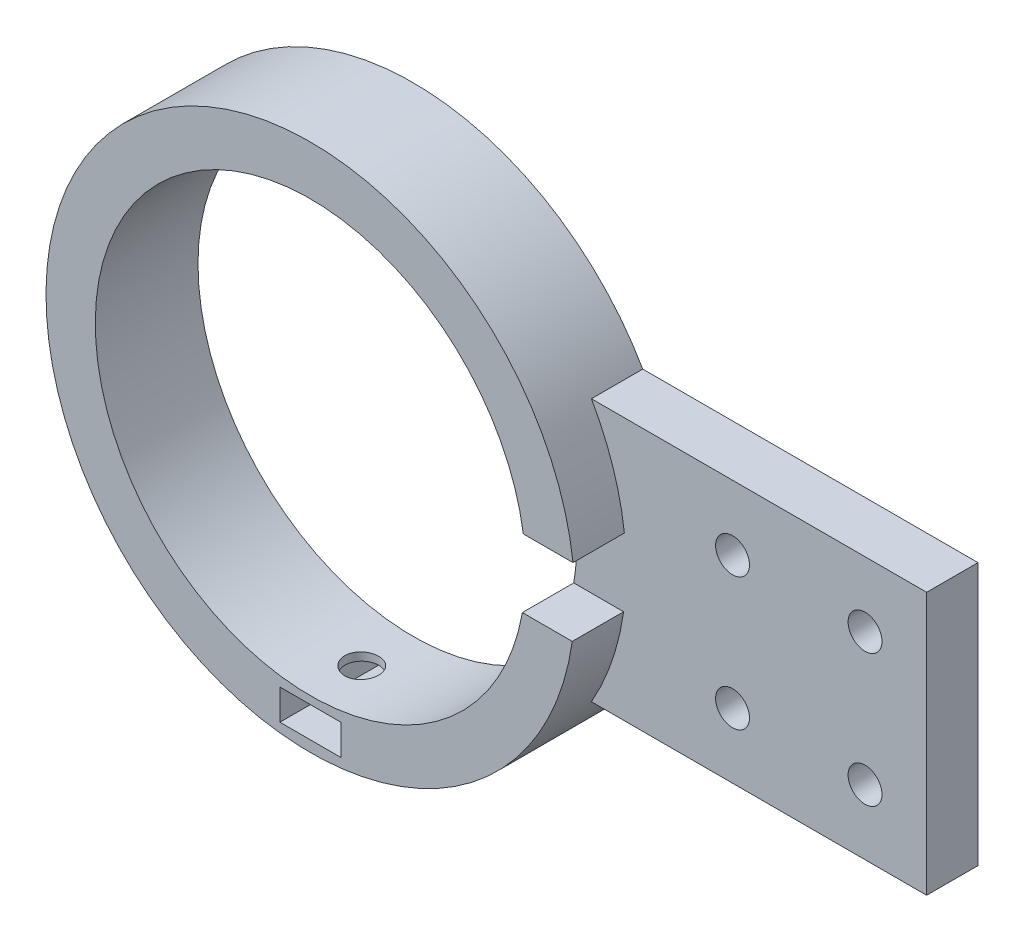
ISO-10303-21;
HEADER;
FILE_DESCRIPTION(('STEP AP214'),'2;1');
FILE_NAME('part.step','',(''),(''),'','','');
FILE_SCHEMA(('AUTOMOTIVE_DESIGN { 1 0 10303 214 1 1 1 1 }'));
ENDSEC;
DATA;
#1=APPLICATION_CONTEXT('core data for automotive mechanical design processes');
#2=APPLICATION_PROTOCOL_DEFINITION('international standard','automotive_design',2000,#1);
#3=PRODUCT_CONTEXT('',#1,'mechanical');
#4=PRODUCT('Part','Part','',(#3));
#5=PRODUCT_RELATED_PRODUCT_CATEGORY('part','',(#4));
#6=PRODUCT_DEFINITION_FORMATION('','',#4);
#7=PRODUCT_DEFINITION_CONTEXT('part definition',#1,'design');
#8=PRODUCT_DEFINITION('design','',#6,#7);
#9=PRODUCT_DEFINITION_SHAPE('','',#8);
#10=(LENGTH_UNIT() NAMED_UNIT(*) SI_UNIT(.MILLI.,.METRE.));
#11=(NAMED_UNIT(*) PLANE_ANGLE_UNIT() SI_UNIT($,.RADIAN.));
#12=(NAMED_UNIT(*) SI_UNIT($,.STERADIAN.) SOLID_ANGLE_UNIT());
#13=UNCERTAINTY_MEASURE_WITH_UNIT(LENGTH_MEASURE(1.E-05),#10,'distance_accuracy_value','');
#14=(GEOMETRIC_REPRESENTATION_CONTEXT(3) GLOBAL_UNCERTAINTY_ASSIGNED_CONTEXT((#13)) GLOBAL_UNIT_ASSIGNED_CONTEXT((#10,
#11,#12)) REPRESENTATION_CONTEXT('',''));
#15=CARTESIAN_POINT('',(0.,0.,0.));
#16=DIRECTION('',(0.,0.,1.));
#17=DIRECTION('',(1.,0.,0.));
#18=AXIS2_PLACEMENT_3D('',#15,#16,#17);
#19=CARTESIAN_POINT('',(0.,0.,20.));
#20=DIRECTION('',(0.,0.,-1.));
#21=DIRECTION('',(-1.,0.,0.));
#22=AXIS2_PLACEMENT_3D('',#19,#20,#21);
#23=CYLINDRICAL_SURFACE('',#22,51.5);
#24=CARTESIAN_POINT('',(0.,-51.5,6.7));
#25=CARTESIAN_POINT('',(-0.185158624066491,-51.499998595781,6.70000814332168));
#26=CARTESIAN_POINT('',(-0.370446658762035,-51.4989907684137,6.71563587599255));
#27=CARTESIAN_POINT('',(-0.735905826523635,-51.4950672369171,6.77775330812579));
#28=CARTESIAN_POINT('',(-0.916070760463318,-51.4921493161301,6.82427886533222));
#29=CARTESIAN_POINT('',(-1.26593717912091,-51.4847356695556,6.94684953728037));
#30=CARTESIAN_POINT('',(-1.4356441546519,-51.4802407801771,7.02287900569621));
#31=CARTESIAN_POINT('',(-1.75984319499285,-51.4701786486996,7.20227375846769));
#32=CARTESIAN_POINT('',(-1.91433871810484,-51.4646116511976,7.30563280969622));
#33=CARTESIAN_POINT('',(-2.20401550029803,-51.4530212339197,7.53692997867651));
#34=CARTESIAN_POINT('',(-2.33916976677004,-51.4469971938843,7.66490187371586));
#35=CARTESIAN_POINT('',(-2.58609660149397,-51.4351769241113,7.94172229421983));
#36=CARTESIAN_POINT('',(-2.69786818952512,-51.4293807039325,8.09057169444957));
#37=CARTESIAN_POINT('',(-2.89494084196966,-51.4186649129284,8.40507570334198));
#38=CARTESIAN_POINT('',(-2.98021935815861,-51.4137460903629,8.57074446872535));
#39=CARTESIAN_POINT('',(-3.12174086726926,-51.4053478632776,8.91408527713376));
#40=CARTESIAN_POINT('',(-3.1779841855537,-51.4018684426282,9.09175718562867));
#41=CARTESIAN_POINT('',(-3.25976351159344,-51.3967473288951,9.45379974080536));
#42=CARTESIAN_POINT('',(-3.28534197322287,-51.3951030953103,9.63816076135591));
#43=CARTESIAN_POINT('',(-3.30519656855818,-51.3938301698441,10.0085663564203));
#44=CARTESIAN_POINT('',(-3.29947307206354,-51.3942014541517,10.1946109110191));
#45=CARTESIAN_POINT('',(-3.25692143983826,-51.3969153363389,10.5628130635802));
#46=CARTESIAN_POINT('',(-3.22013925827641,-51.3992550217702,10.7449759967299));
#47=CARTESIAN_POINT('',(-3.11658565300897,-51.4056374563983,11.1005367771904));
#48=CARTESIAN_POINT('',(-3.04981404212357,-51.4096802162248,11.2739345697858));
#49=CARTESIAN_POINT('',(-2.88812485808855,-51.4190165642569,11.6071904946078));
#50=CARTESIAN_POINT('',(-2.7931864539019,-51.4243110776188,11.767038493059));
#51=CARTESIAN_POINT('',(-2.57787372714138,-51.4355533621287,12.0685465381497));
#52=CARTESIAN_POINT('',(-2.45749910351232,-51.4415011410081,12.2102063694879));
#53=CARTESIAN_POINT('',(-2.19447218095502,-51.4533926247903,12.4715842364733));
#54=CARTESIAN_POINT('',(-2.05178011413515,-51.4593363030214,12.5912622582034));
#55=CARTESIAN_POINT('',(-1.74830817960783,-51.470539481302,12.8049705907161));
#56=CARTESIAN_POINT('',(-1.58752830527452,-51.475798981101,12.8990008921036));
#57=CARTESIAN_POINT('',(-1.25242032545124,-51.4850415932231,13.0587412787928));
#58=CARTESIAN_POINT('',(-1.07809148747595,-51.4890246364787,13.1244498317027));
#59=CARTESIAN_POINT('',(-0.720845051352231,-51.495264589276,13.2256546815547));
#60=CARTESIAN_POINT('',(-0.537927558655072,-51.4975215200049,13.2611513493352));
#61=CARTESIAN_POINT('',(-0.16904332343586,-51.5000522004809,13.3008751881885));
#62=CARTESIAN_POINT('',(0.0169174389331067,-51.5003294586863,13.3051576786126));
#63=CARTESIAN_POINT('',(0.386914647836279,-51.4988788860668,13.2824761641035));
#64=CARTESIAN_POINT('',(0.570951104898467,-51.4971510662174,13.2555123302111));
#65=CARTESIAN_POINT('',(0.931719616748088,-51.4918870916977,13.1711493790303));
#66=CARTESIAN_POINT('',(1.10845763445804,-51.4883524461368,13.1137756594227));
#67=CARTESIAN_POINT('',(1.44979641038688,-51.479872440234,12.9702473716029));
#68=CARTESIAN_POINT('',(1.61439705389386,-51.4749270665614,12.8840925314191));
#69=CARTESIAN_POINT('',(1.92704189399144,-51.464172455098,12.6853069196648));
#70=CARTESIAN_POINT('',(2.07506256989622,-51.4583620166392,12.572639221297));
#71=CARTESIAN_POINT('',(2.35010888990498,-51.4465351339532,12.3240798385812));
#72=CARTESIAN_POINT('',(2.47713431698027,-51.4405186875973,12.188187914193));
#73=CARTESIAN_POINT('',(2.70677189951301,-51.4289477078512,11.8967987944526));
#74=CARTESIAN_POINT('',(2.80934815222252,-51.423393861458,11.7412732739043));
#75=CARTESIAN_POINT('',(2.98692999648366,-51.4133853552325,11.4151740364177));
#76=CARTESIAN_POINT('',(3.06193576509112,-51.4089306883413,11.2446004161259));
#77=CARTESIAN_POINT('',(3.18218539932524,-51.4016278688749,10.8933778121221));
#78=CARTESIAN_POINT('',(3.2274518213567,-51.3987784989643,10.7127365774758));
#79=CARTESIAN_POINT('',(3.28701146821876,-51.3950042318312,10.3463989420834));
#80=CARTESIAN_POINT('',(3.30130501921366,-51.3940793143431,10.1607025945918));
#81=CARTESIAN_POINT('',(3.29851000252764,-51.3942587483183,9.78988295058416));
#82=CARTESIAN_POINT('',(3.28147787672075,-51.3953594500701,9.60475922423373));
#83=CARTESIAN_POINT('',(3.21663204976162,-51.3994583542873,9.24000600163931));
#84=CARTESIAN_POINT('',(3.1688182933105,-51.4024565601615,9.06037651526627));
#85=CARTESIAN_POINT('',(3.0437792821893,-51.4100117078721,8.71170262328394));
#86=CARTESIAN_POINT('',(2.9665543134305,-51.4145686345559,8.54265811479492));
#87=CARTESIAN_POINT('',(2.78489264182225,-51.4247276387026,8.21992657033912));
#88=CARTESIAN_POINT('',(2.68045662543272,-51.4303296897989,8.06623914709059));
#89=CARTESIAN_POINT('',(2.44712835653953,-51.4419594465964,7.77829789974838));
#90=CARTESIAN_POINT('',(2.31819519824359,-51.4479878535114,7.64407725228515));
#91=CARTESIAN_POINT('',(2.03958946113101,-51.4597849959815,7.39913821921457));
#92=CARTESIAN_POINT('',(1.88991181961761,-51.4655536676914,7.2884255874964));
#93=CARTESIAN_POINT('',(1.57388788429359,-51.4761875824393,7.09355948688749));
#94=CARTESIAN_POINT('',(1.40752054283301,-51.4810516620611,7.0094401242557));
#95=CARTESIAN_POINT('',(1.06311300413596,-51.4893128617732,6.87043160822301));
#96=CARTESIAN_POINT('',(0.885086736678297,-51.492711696953,6.81550826280881));
#97=CARTESIAN_POINT('',(0.588311513144641,-51.4967699513685,6.75070701809405));
#98=CARTESIAN_POINT('',(0.471480291549071,-51.4979758278887,6.73171651921337));
#99=CARTESIAN_POINT('',(0.236450306369965,-51.499591300025,6.70636041902111));
#100=CARTESIAN_POINT('',(0.118251544784278,-51.5000008968044,6.69999479926807));
#101=CARTESIAN_POINT('',(0.,-51.5,6.7));
#102=B_SPLINE_CURVE_WITH_KNOTS('',3,(#24,#25,#26,#27,#28,#29,#30,#31,#32,#33,#34,#35,#36,#37,
#38,#39,#40,#41,#42,#43,#44,#45,#46,#47,#48,#49,#50,#51,#52,#53,#54,#55,#56,#57,#58,#59,#60,#61,
#62,#63,#64,#65,#66,#67,#68,#69,#70,#71,#72,#73,#74,#75,#76,#77,#78,#79,#80,#81,#82,#83,#84,#85,
#86,#87,#88,#89,#90,#91,#92,#93,#94,#95,#96,#97,#98,#99,#100,#101),.UNSPECIFIED.,.T.,.F.,(4,2,2,
2,2,2,2,2,2,2,2,2,2,2,2,2,2,2,2,2,2,2,2,2,2,2,2,2,2,2,2,2,2,2,2,2,2,2,4),(0.,0.555044180037114,
1.11073363183171,1.66612879577552,2.22139739843652,2.77743352917521,3.3334929647292,
3.89002437345546,4.44654954566416,5.002303345113,5.55805057893358,6.11297697175668,
6.66790682821565,7.22324811606526,7.77859597713011,8.33494494118436,8.89129410903918,
9.44767337524364,10.0040458120242,10.5594319770078,11.1148151018512,11.6697351118805,
12.2246603658593,12.7803631361644,13.3360716504313,13.8925912436079,14.4491072627902,
15.0052006924153,15.5612882659899,16.1163748753379,16.6714624818961,17.2265446924933,
17.781612901248,18.3376162514462,18.8937555341403,19.4506052069624,20.0068012977053,
20.3612807496798,20.7157596838576),.UNSPECIFIED.);
#103=CARTESIAN_POINT('',(0.,-51.5,6.7));
#104=VERTEX_POINT('',#103);
#105=EDGE_CURVE('E249',#104,#104,#102,.T.);
#106=ORIENTED_EDGE('',*,*,#105,.T.);
#107=EDGE_LOOP('',(#106));
#108=FACE_BOUND('',#107,.T.);
#109=CARTESIAN_POINT('',(0.,0.,20.));
#110=DIRECTION('',(0.,0.,1.));
#111=DIRECTION('',(1.,0.,0.));
#112=AXIS2_PLACEMENT_3D('',#109,#110,#111);
#113=CIRCLE('',#112,51.5);
#114=CARTESIAN_POINT('',(51.135544310776,6.11605330590421,20.));
#115=VERTEX_POINT('',#114);
#116=CARTESIAN_POINT('',(50.9892238996445,-7.23526406649588,20.));
#117=VERTEX_POINT('',#116);
#118=EDGE_CURVE('E197',#115,#117,#113,.T.);
#119=ORIENTED_EDGE('',*,*,#118,.F.);
#120=DIRECTION('',(0.,0.,-1.));
#121=VECTOR('',#120,1.);
#122=CARTESIAN_POINT('',(51.135544310776,6.11605330590421,20.));
#123=LINE('',#122,#121);
#124=CARTESIAN_POINT('',(51.135544310776,6.11605330590421,10.));
#125=VERTEX_POINT('',#124);
#126=EDGE_CURVE('E165',#115,#125,#123,.T.);
#127=ORIENTED_EDGE('',*,*,#126,.T.);
#128=CARTESIAN_POINT('',(0.,0.,10.));
#129=DIRECTION('',(0.,0.,1.));
#130=DIRECTION('',(1.,0.,0.));
#131=AXIS2_PLACEMENT_3D('',#128,#129,#130);
#132=CIRCLE('',#131,51.5);
#133=CARTESIAN_POINT('',(44.7151819855404,25.55,10.));
#134=VERTEX_POINT('',#133);
#135=EDGE_CURVE('E200',#125,#134,#132,.T.);
#136=ORIENTED_EDGE('',*,*,#135,.T.);
#137=DIRECTION('',(0.,0.,-1.));
#138=VECTOR('',#137,1.);
#139=CARTESIAN_POINT('',(44.7151819855404,25.55,20.));
#140=LINE('',#139,#138);
#141=CARTESIAN_POINT('',(44.7151819855404,25.55,0.));
#142=VERTEX_POINT('',#141);
#143=EDGE_CURVE('E187',#142,#134,#140,.F.);
#144=ORIENTED_EDGE('',*,*,#143,.F.);
#145=CARTESIAN_POINT('',(0.,0.,0.));
#146=DIRECTION('',(0.,0.,1.));
#147=DIRECTION('',(1.,0.,0.));
#148=AXIS2_PLACEMENT_3D('',#145,#146,#147);
#149=CIRCLE('',#148,51.5);
#150=CARTESIAN_POINT('',(44.7151819855404,-25.55,0.));
#151=VERTEX_POINT('',#150);
#152=EDGE_CURVE('E196',#142,#151,#149,.T.);
#153=ORIENTED_EDGE('',*,*,#152,.T.);
#154=DIRECTION('',(0.,0.,-1.));
#155=VECTOR('',#154,1.);
#156=CARTESIAN_POINT('',(44.7151819855404,-25.55,20.));
#157=LINE('',#156,#155);
#158=CARTESIAN_POINT('',(44.7151819855404,-25.55,10.));
#159=VERTEX_POINT('',#158);
#160=EDGE_CURVE('E193',#159,#151,#157,.T.);
#161=ORIENTED_EDGE('',*,*,#160,.F.);
#162=CARTESIAN_POINT('',(50.9892238996445,-7.23526406649588,10.));
#163=VERTEX_POINT('',#162);
#164=EDGE_CURVE('E202',#159,#163,#132,.T.);
#165=ORIENTED_EDGE('',*,*,#164,.T.);
#166=DIRECTION('',(0.,0.,-1.));
#167=VECTOR('',#166,1.);
#168=CARTESIAN_POINT('',(50.9892238996445,-7.23526406649588,20.));
#169=LINE('',#168,#167);
#170=EDGE_CURVE('E160',#163,#117,#169,.F.);
#171=ORIENTED_EDGE('',*,*,#170,.T.);
#172=EDGE_LOOP('',(#119,#127,#136,#144,#153,#161,#165,#171));
#173=FACE_BOUND('',#172,.T.);
#174=ADVANCED_FACE('F35',(#108,#173),#23,.T.);
#175=CARTESIAN_POINT('',(0.,0.,20.));
#176=DIRECTION('',(0.,0.,1.));
#177=DIRECTION('',(1.,0.,0.));
#178=AXIS2_PLACEMENT_3D('',#175,#176,#177);
#179=PLANE('',#178);
#180=DIRECTION('',(0.,-1.,0.));
#181=VECTOR('',#180,1.);
#182=CARTESIAN_POINT('',(-5.94999999999999,-43.4,20.));
#183=LINE('',#182,#181);
#184=CARTESIAN_POINT('',(-5.94999999999999,-43.4,20.));
#185=VERTEX_POINT('',#184);
#186=CARTESIAN_POINT('',(-5.94999999999999,-49.34,20.));
#187=VERTEX_POINT('',#186);
#188=EDGE_CURVE('E51',#185,#187,#183,.T.);
#189=ORIENTED_EDGE('',*,*,#188,.F.);
#190=DIRECTION('',(-1.,0.,0.));
#191=VECTOR('',#190,1.);
#192=CARTESIAN_POINT('',(-5.94999999999999,-43.4,20.));
#193=LINE('',#192,#191);
#194=CARTESIAN_POINT('',(5.95000000000001,-43.4,20.));
#195=VERTEX_POINT('',#194);
#196=EDGE_CURVE('E144',#195,#185,#193,.T.);
#197=ORIENTED_EDGE('',*,*,#196,.F.);
#198=DIRECTION('',(0.,1.,0.));
#199=VECTOR('',#198,1.);
#200=CARTESIAN_POINT('',(5.95000000000001,-43.4,20.));
#201=LINE('',#200,#199);
#202=CARTESIAN_POINT('',(5.95000000000001,-49.34,20.));
#203=VERTEX_POINT('',#202);
#204=EDGE_CURVE('E128',#203,#195,#201,.T.);
#205=ORIENTED_EDGE('',*,*,#204,.F.);
#206=DIRECTION('',(1.,0.,0.));
#207=VECTOR('',#206,1.);
#208=CARTESIAN_POINT('',(-5.94999999999999,-49.34,20.));
#209=LINE('',#208,#207);
#210=EDGE_CURVE('E137',#187,#203,#209,.T.);
#211=ORIENTED_EDGE('',*,*,#210,.F.);
#212=EDGE_LOOP('',(#189,#197,#205,#211));
#213=FACE_BOUND('',#212,.T.);
#214=DIRECTION('',(-1.,0.,0.));
#215=VECTOR('',#214,1.);
#216=CARTESIAN_POINT('',(39.,6.11605330590421,20.));
#217=LINE('',#216,#215);
#218=CARTESIAN_POINT('',(41.451223045398,6.11605330590421,20.));
#219=VERTEX_POINT('',#218);
#220=EDGE_CURVE('E158',#115,#219,#217,.T.);
#221=ORIENTED_EDGE('',*,*,#220,.F.);
#222=ORIENTED_EDGE('',*,*,#118,.T.);
#223=DIRECTION('',(1.,0.,0.));
#224=VECTOR('',#223,1.);
#225=CARTESIAN_POINT('',(39.,-7.23526406649589,20.));
#226=LINE('',#225,#224);
#227=CARTESIAN_POINT('',(41.2705821849907,-7.23526406649589,20.));
#228=VERTEX_POINT('',#227);
#229=EDGE_CURVE('E151',#228,#117,#226,.T.);
#230=ORIENTED_EDGE('',*,*,#229,.F.);
#231=CARTESIAN_POINT('',(0.,0.,20.));
#232=DIRECTION('',(0.,0.,1.));
#233=DIRECTION('',(1.,0.,0.));
#234=AXIS2_PLACEMENT_3D('',#231,#232,#233);
#235=CIRCLE('',#234,41.9);
#236=EDGE_CURVE('E168',#219,#228,#235,.T.);
#237=ORIENTED_EDGE('',*,*,#236,.F.);
#238=EDGE_LOOP('',(#221,#222,#230,#237));
#239=FACE_BOUND('',#238,.T.);
#240=ADVANCED_FACE('F141',(#213,#239),#179,.T.);
#241=CARTESIAN_POINT('',(0.,0.,0.));
#242=DIRECTION('',(0.,0.,1.));
#243=DIRECTION('',(1.,0.,0.));
#244=AXIS2_PLACEMENT_3D('',#241,#242,#243);
#245=PLANE('',#244);
#246=CARTESIAN_POINT('',(98.,12.9,0.));
#247=DIRECTION('',(0.,0.,1.));
#248=DIRECTION('',(1.,0.,0.));
#249=AXIS2_PLACEMENT_3D('',#246,#247,#248);
#250=CIRCLE('',#249,3.3);
#251=CARTESIAN_POINT('',(101.3,12.9,0.));
#252=VERTEX_POINT('',#251);
#253=EDGE_CURVE('E359',#252,#252,#250,.T.);
#254=ORIENTED_EDGE('',*,*,#253,.T.);
#255=EDGE_LOOP('',(#254));
#256=FACE_BOUND('',#255,.T.);
#257=CARTESIAN_POINT('',(98.,-12.9,0.));
#258=DIRECTION('',(0.,0.,1.));
#259=DIRECTION('',(1.,0.,0.));
#260=AXIS2_PLACEMENT_3D('',#257,#258,#259);
#261=CIRCLE('',#260,3.3);
#262=CARTESIAN_POINT('',(101.3,-12.9,0.));
#263=VERTEX_POINT('',#262);
#264=EDGE_CURVE('E364',#263,#263,#261,.T.);
#265=ORIENTED_EDGE('',*,*,#264,.T.);
#266=EDGE_LOOP('',(#265));
#267=FACE_BOUND('',#266,.T.);
#268=CARTESIAN_POINT('',(72.2,-12.9,0.));
#269=DIRECTION('',(0.,0.,1.));
#270=DIRECTION('',(1.,0.,0.));
#271=AXIS2_PLACEMENT_3D('',#268,#269,#270);
#272=CIRCLE('',#271,3.29999999999999);
#273=CARTESIAN_POINT('',(75.5,-12.9,0.));
#274=VERTEX_POINT('',#273);
#275=EDGE_CURVE('E367',#274,#274,#272,.T.);
#276=ORIENTED_EDGE('',*,*,#275,.T.);
#277=EDGE_LOOP('',(#276));
#278=FACE_BOUND('',#277,.T.);
#279=CARTESIAN_POINT('',(72.2,12.9,0.));
#280=DIRECTION('',(0.,0.,1.));
#281=DIRECTION('',(1.,0.,0.));
#282=AXIS2_PLACEMENT_3D('',#279,#280,#281);
#283=CIRCLE('',#282,3.29999999999999);
#284=CARTESIAN_POINT('',(75.5,12.9,0.));
#285=VERTEX_POINT('',#284);
#286=EDGE_CURVE('E353',#285,#285,#283,.T.);
#287=ORIENTED_EDGE('',*,*,#286,.T.);
#288=EDGE_LOOP('',(#287));
#289=FACE_BOUND('',#288,.T.);
#290=DIRECTION('',(-1.,0.,0.));
#291=VECTOR('',#290,1.);
#292=CARTESIAN_POINT('',(0.,-43.4,0.));
#293=LINE('',#292,#291);
#294=CARTESIAN_POINT('',(5.95000000000001,-43.4,0.));
#295=VERTEX_POINT('',#294);
#296=CARTESIAN_POINT('',(-5.94999999999999,-43.4,0.));
#297=VERTEX_POINT('',#296);
#298=EDGE_CURVE('E44',#295,#297,#293,.T.);
#299=ORIENTED_EDGE('',*,*,#298,.T.);
#300=DIRECTION('',(0.,-1.,0.));
#301=VECTOR('',#300,1.);
#302=CARTESIAN_POINT('',(-5.95,0.,0.));
#303=LINE('',#302,#301);
#304=CARTESIAN_POINT('',(-5.94999999999999,-49.34,0.));
#305=VERTEX_POINT('',#304);
#306=EDGE_CURVE('E12',#297,#305,#303,.T.);
#307=ORIENTED_EDGE('',*,*,#306,.T.);
#308=DIRECTION('',(1.,0.,0.));
#309=VECTOR('',#308,1.);
#310=CARTESIAN_POINT('',(0.,-49.34,0.));
#311=LINE('',#310,#309);
#312=CARTESIAN_POINT('',(5.95000000000001,-49.34,0.));
#313=VERTEX_POINT('',#312);
#314=EDGE_CURVE('E215',#305,#313,#311,.T.);
#315=ORIENTED_EDGE('',*,*,#314,.T.);
#316=DIRECTION('',(0.,1.,0.));
#317=VECTOR('',#316,1.);
#318=CARTESIAN_POINT('',(5.95,0.,0.));
#319=LINE('',#318,#317);
#320=EDGE_CURVE('E131',#313,#295,#319,.T.);
#321=ORIENTED_EDGE('',*,*,#320,.T.);
#322=EDGE_LOOP('',(#299,#307,#315,#321));
#323=FACE_BOUND('',#322,.T.);
#324=CARTESIAN_POINT('',(0.,0.,0.));
#325=DIRECTION('',(0.,0.,1.));
#326=DIRECTION('',(1.,0.,0.));
#327=AXIS2_PLACEMENT_3D('',#324,#325,#326);
#328=CIRCLE('',#327,41.9);
#329=CARTESIAN_POINT('',(41.9,0.,0.));
#330=VERTEX_POINT('',#329);
#331=EDGE_CURVE('E171',#330,#330,#328,.T.);
#332=ORIENTED_EDGE('',*,*,#331,.T.);
#333=EDGE_LOOP('',(#332));
#334=FACE_BOUND('',#333,.T.);
#335=ORIENTED_EDGE('',*,*,#152,.F.);
#336=DIRECTION('',(1.,0.,0.));
#337=VECTOR('',#336,1.);
#338=CARTESIAN_POINT('',(0.,25.55,0.));
#339=LINE('',#338,#337);
#340=CARTESIAN_POINT('',(110.,25.55,0.));
#341=VERTEX_POINT('',#340);
#342=EDGE_CURVE('E184',#142,#341,#339,.T.);
#343=ORIENTED_EDGE('',*,*,#342,.T.);
#344=DIRECTION('',(0.,-1.,0.));
#345=VECTOR('',#344,1.);
#346=CARTESIAN_POINT('',(110.,-25.55,0.));
#347=LINE('',#346,#345);
#348=CARTESIAN_POINT('',(110.,-25.55,0.));
#349=VERTEX_POINT('',#348);
#350=EDGE_CURVE('E277',#341,#349,#347,.T.);
#351=ORIENTED_EDGE('',*,*,#350,.T.);
#352=DIRECTION('',(-1.,0.,0.));
#353=VECTOR('',#352,1.);
#354=CARTESIAN_POINT('',(0.,-25.55,0.));
#355=LINE('',#354,#353);
#356=EDGE_CURVE('E172',#349,#151,#355,.T.);
#357=ORIENTED_EDGE('',*,*,#356,.T.);
#358=EDGE_LOOP('',(#335,#343,#351,#357));
#359=FACE_BOUND('',#358,.T.);
#360=ADVANCED_FACE('F220',(#256,#267,#278,#289,#323,#334,#359),#245,.F.);
#361=CARTESIAN_POINT('',(0.,-25.55,0.));
#362=DIRECTION('',(0.,1.,0.));
#363=DIRECTION('',(0.,0.,1.));
#364=AXIS2_PLACEMENT_3D('',#361,#362,#363);
#365=PLANE('',#364);
#366=DIRECTION('',(-1.,0.,0.));
#367=VECTOR('',#366,1.);
#368=CARTESIAN_POINT('',(0.,-25.55,10.));
#369=LINE('',#368,#367);
#370=CARTESIAN_POINT('',(110.,-25.55,10.));
#371=VERTEX_POINT('',#370);
#372=EDGE_CURVE('E181',#371,#159,#369,.T.);
#373=ORIENTED_EDGE('',*,*,#372,.T.);
#374=ORIENTED_EDGE('',*,*,#160,.T.);
#375=ORIENTED_EDGE('',*,*,#356,.F.);
#376=DIRECTION('',(0.,0.,1.));
#377=VECTOR('',#376,1.);
#378=CARTESIAN_POINT('',(110.,-25.55,0.));
#379=LINE('',#378,#377);
#380=EDGE_CURVE('E176',#349,#371,#379,.T.);
#381=ORIENTED_EDGE('',*,*,#380,.T.);
#382=EDGE_LOOP('',(#373,#374,#375,#381));
#383=FACE_BOUND('',#382,.T.);
#384=ADVANCED_FACE('F296',(#383),#365,.F.);
#385=CARTESIAN_POINT('',(0.,25.55,0.));
#386=DIRECTION('',(0.,-1.,0.));
#387=DIRECTION('',(0.,0.,-1.));
#388=AXIS2_PLACEMENT_3D('',#385,#386,#387);
#389=PLANE('',#388);
#390=ORIENTED_EDGE('',*,*,#342,.F.);
#391=ORIENTED_EDGE('',*,*,#143,.T.);
#392=DIRECTION('',(1.,0.,0.));
#393=VECTOR('',#392,1.);
#394=CARTESIAN_POINT('',(0.,25.55,10.));
#395=LINE('',#394,#393);
#396=CARTESIAN_POINT('',(110.,25.55,10.));
#397=VERTEX_POINT('',#396);
#398=EDGE_CURVE('E188',#134,#397,#395,.T.);
#399=ORIENTED_EDGE('',*,*,#398,.T.);
#400=DIRECTION('',(0.,0.,1.));
#401=VECTOR('',#400,1.);
#402=CARTESIAN_POINT('',(110.,25.55,0.));
#403=LINE('',#402,#401);
#404=EDGE_CURVE('E273',#341,#397,#403,.T.);
#405=ORIENTED_EDGE('',*,*,#404,.F.);
#406=EDGE_LOOP('',(#390,#391,#399,#405));
#407=FACE_BOUND('',#406,.T.);
#408=ADVANCED_FACE('F270',(#407),#389,.F.);
#409=CARTESIAN_POINT('',(0.,0.,10.));
#410=DIRECTION('',(0.,0.,1.));
#411=DIRECTION('',(1.,0.,0.));
#412=AXIS2_PLACEMENT_3D('',#409,#410,#411);
#413=PLANE('',#412);
#414=CARTESIAN_POINT('',(98.,12.9,10.));
#415=DIRECTION('',(0.,0.,1.));
#416=DIRECTION('',(1.,0.,0.));
#417=AXIS2_PLACEMENT_3D('',#414,#415,#416);
#418=CIRCLE('',#417,3.3);
#419=CARTESIAN_POINT('',(101.3,12.9,10.));
#420=VERTEX_POINT('',#419);
#421=EDGE_CURVE('E370',#420,#420,#418,.T.);
#422=ORIENTED_EDGE('',*,*,#421,.F.);
#423=EDGE_LOOP('',(#422));
#424=FACE_BOUND('',#423,.T.);
#425=CARTESIAN_POINT('',(98.,-12.9,10.));
#426=DIRECTION('',(0.,0.,1.));
#427=DIRECTION('',(1.,0.,0.));
#428=AXIS2_PLACEMENT_3D('',#425,#426,#427);
#429=CIRCLE('',#428,3.3);
#430=CARTESIAN_POINT('',(101.3,-12.9,10.));
#431=VERTEX_POINT('',#430);
#432=EDGE_CURVE('E374',#431,#431,#429,.T.);
#433=ORIENTED_EDGE('',*,*,#432,.F.);
#434=EDGE_LOOP('',(#433));
#435=FACE_BOUND('',#434,.T.);
#436=CARTESIAN_POINT('',(72.2,-12.9,10.));
#437=DIRECTION('',(0.,0.,1.));
#438=DIRECTION('',(1.,0.,0.));
#439=AXIS2_PLACEMENT_3D('',#436,#437,#438);
#440=CIRCLE('',#439,3.29999999999999);
#441=CARTESIAN_POINT('',(75.5,-12.9,10.));
#442=VERTEX_POINT('',#441);
#443=EDGE_CURVE('E371',#442,#442,#440,.T.);
#444=ORIENTED_EDGE('',*,*,#443,.F.);
#445=EDGE_LOOP('',(#444));
#446=FACE_BOUND('',#445,.T.);
#447=CARTESIAN_POINT('',(72.2,12.9,10.));
#448=DIRECTION('',(0.,0.,1.));
#449=DIRECTION('',(1.,0.,0.));
#450=AXIS2_PLACEMENT_3D('',#447,#448,#449);
#451=CIRCLE('',#450,3.29999999999999);
#452=CARTESIAN_POINT('',(75.5,12.9,10.));
#453=VERTEX_POINT('',#452);
#454=EDGE_CURVE('E355',#453,#453,#451,.T.);
#455=ORIENTED_EDGE('',*,*,#454,.F.);
#456=EDGE_LOOP('',(#455));
#457=FACE_BOUND('',#456,.T.);
#458=ORIENTED_EDGE('',*,*,#135,.F.);
#459=DIRECTION('',(-1.,0.,0.));
#460=VECTOR('',#459,1.);
#461=CARTESIAN_POINT('',(39.,6.11605330590421,10.));
#462=LINE('',#461,#460);
#463=CARTESIAN_POINT('',(41.451223045398,6.11605330590421,10.));
#464=VERTEX_POINT('',#463);
#465=EDGE_CURVE('E157',#125,#464,#462,.T.);
#466=ORIENTED_EDGE('',*,*,#465,.T.);
#467=CARTESIAN_POINT('',(0.,0.,10.));
#468=DIRECTION('',(0.,0.,1.));
#469=DIRECTION('',(1.,0.,0.));
#470=AXIS2_PLACEMENT_3D('',#467,#468,#469);
#471=CIRCLE('',#470,41.9);
#472=CARTESIAN_POINT('',(41.2705821849907,-7.23526406649589,10.));
#473=VERTEX_POINT('',#472);
#474=EDGE_CURVE('E205',#464,#473,#471,.F.);
#475=ORIENTED_EDGE('',*,*,#474,.T.);
#476=DIRECTION('',(1.,0.,0.));
#477=VECTOR('',#476,1.);
#478=CARTESIAN_POINT('',(39.,-7.23526406649589,10.));
#479=LINE('',#478,#477);
#480=EDGE_CURVE('E154',#473,#163,#479,.T.);
#481=ORIENTED_EDGE('',*,*,#480,.T.);
#482=ORIENTED_EDGE('',*,*,#164,.F.);
#483=ORIENTED_EDGE('',*,*,#372,.F.);
#484=DIRECTION('',(0.,-1.,0.));
#485=VECTOR('',#484,1.);
#486=CARTESIAN_POINT('',(110.,-25.55,10.));
#487=LINE('',#486,#485);
#488=EDGE_CURVE('E175',#397,#371,#487,.T.);
#489=ORIENTED_EDGE('',*,*,#488,.F.);
#490=ORIENTED_EDGE('',*,*,#398,.F.);
#491=EDGE_LOOP('',(#458,#466,#475,#481,#482,#483,#489,#490));
#492=FACE_BOUND('',#491,.T.);
#493=ADVANCED_FACE('F263',(#424,#435,#446,#457,#492),#413,.T.);
#494=CARTESIAN_POINT('',(110.,-25.55,0.));
#495=DIRECTION('',(-1.,0.,0.));
#496=DIRECTION('',(0.,0.,1.));
#497=AXIS2_PLACEMENT_3D('',#494,#495,#496);
#498=PLANE('',#497);
#499=ORIENTED_EDGE('',*,*,#488,.T.);
#500=ORIENTED_EDGE('',*,*,#380,.F.);
#501=ORIENTED_EDGE('',*,*,#350,.F.);
#502=ORIENTED_EDGE('',*,*,#404,.T.);
#503=EDGE_LOOP('',(#499,#500,#501,#502));
#504=FACE_BOUND('',#503,.T.);
#505=ADVANCED_FACE('F280',(#504),#498,.F.);
#506=CARTESIAN_POINT('',(0.,0.,-0.000103077640641741));
#507=DIRECTION('',(0.,0.,1.));
#508=DIRECTION('',(1.,0.,0.));
#509=AXIS2_PLACEMENT_3D('',#506,#507,#508);
#510=CYLINDRICAL_SURFACE('',#509,41.9);
#511=CARTESIAN_POINT('',(0.,-41.9,6.7));
#512=CARTESIAN_POINT('',(0.185054775502048,-41.8999982912202,6.70000809811897));
#513=CARTESIAN_POINT('',(0.370236407078066,-41.8987609561517,6.71561837859419));
#514=CARTESIAN_POINT('',(0.735478586031216,-41.8939439445415,6.77766244189761));
#515=CARTESIAN_POINT('',(0.915533048319414,-41.8903615966414,6.82413137872556));
#516=CARTESIAN_POINT('',(1.26517800921156,-41.8812594888269,6.9465428704493));
#517=CARTESIAN_POINT('',(1.43477427027815,-41.8757408072514,7.02246902318752));
#518=CARTESIAN_POINT('',(1.75877364113602,-41.8633853627877,7.20161098633945));
#519=CARTESIAN_POINT('',(1.91318004664251,-41.8565488867757,7.30482085905636));
#520=CARTESIAN_POINT('',(2.20281217650519,-41.8423077855617,7.53585669006654));
#521=CARTESIAN_POINT('',(2.33799830800279,-41.8349020346495,7.66373221786212));
#522=CARTESIAN_POINT('',(2.58501294758466,-41.8203665395405,7.94036512426536));
#523=CARTESIAN_POINT('',(2.69684044212043,-41.8132368073313,8.08912340852316));
#524=CARTESIAN_POINT('',(2.89409531784173,-41.8000482461923,8.40353609148539));
#525=CARTESIAN_POINT('',(2.97948824565634,-41.79399081921,8.56921216924338));
#526=CARTESIAN_POINT('',(3.12122985779605,-41.7836451766887,8.91260622049709));
#527=CARTESIAN_POINT('',(3.1775790059168,-41.7793569328982,9.09032400164943));
#528=CARTESIAN_POINT('',(3.2595195507848,-41.773044361759,9.45236260634322));
#529=CARTESIAN_POINT('',(3.28517502740181,-41.7710153184431,9.63666884305421));
#530=CARTESIAN_POINT('',(3.30519789272393,-41.7694358703997,10.0069819269646));
#531=CARTESIAN_POINT('',(3.29956581170933,-41.7698854236635,10.1929887452881));
#532=CARTESIAN_POINT('',(3.25722643996087,-41.7732080994973,10.5609844212765));
#533=CARTESIAN_POINT('',(3.22058871599365,-41.7760757964728,10.7429813387003));
#534=CARTESIAN_POINT('',(3.11738610613326,-41.7839031121158,11.0982343341911));
#535=CARTESIAN_POINT('',(3.05082095536995,-41.7888627492977,11.2714903348821));
#536=CARTESIAN_POINT('',(2.88957487597714,-41.8003213435136,11.6045655426387));
#537=CARTESIAN_POINT('',(2.79486265143948,-41.806822012339,11.764369537667));
#538=CARTESIAN_POINT('',(2.58003354205637,-41.8206285702251,12.065838147197));
#539=CARTESIAN_POINT('',(2.45991619846679,-41.8279344738249,12.2075024340731));
#540=CARTESIAN_POINT('',(2.19729596360362,-41.8425524064377,12.46907485363));
#541=CARTESIAN_POINT('',(2.05473291558105,-41.849864397817,12.5889225990016));
#542=CARTESIAN_POINT('',(1.7514782293426,-41.8636515762258,12.8029932683186));
#543=CARTESIAN_POINT('',(1.59078658064333,-41.8701267627714,12.8972161774457));
#544=CARTESIAN_POINT('',(1.25579752372492,-41.8815117819819,13.0573584452194));
#545=CARTESIAN_POINT('',(1.08149887695809,-41.8864214719437,13.1232752238033));
#546=CARTESIAN_POINT('',(0.724261130311104,-41.8941206055649,13.2248922910156));
#547=CARTESIAN_POINT('',(0.541322190662654,-41.8969100885265,13.2605931397574));
#548=CARTESIAN_POINT('',(0.172520372160179,-41.9000494570257,13.3006894360542));
#549=CARTESIAN_POINT('',(-0.0133333831769272,-41.9004058441374,13.3051683137808));
#550=CARTESIAN_POINT('',(-0.3831492220941,-41.898656212331,13.2829119486116));
#551=CARTESIAN_POINT('',(-0.567111321396423,-41.8965502138954,13.2561769653577));
#552=CARTESIAN_POINT('',(-0.927684652250021,-41.8901168937015,13.1723209190377));
#553=CARTESIAN_POINT('',(-1.1043049095571,-41.8857923921724,13.1152384313113));
#554=CARTESIAN_POINT('',(-1.44546029792756,-41.8754080373524,12.9723470823991));
#555=CARTESIAN_POINT('',(-1.60999525771217,-41.8693481594728,12.8865378141789));
#556=CARTESIAN_POINT('',(-1.92268976830318,-41.8561565375354,12.6884183882039));
#557=CARTESIAN_POINT('',(-2.07081413487842,-41.8490225649742,12.5760528493691));
#558=CARTESIAN_POINT('',(-2.34612782680029,-41.834492082352,12.3280906749573));
#559=CARTESIAN_POINT('',(-2.47331682712321,-41.8270955682171,12.1924936787762));
#560=CARTESIAN_POINT('',(-2.70343467385639,-41.8128544804271,11.9015561573913));
#561=CARTESIAN_POINT('',(-2.80630915400835,-41.8060111657504,11.7461725609135));
#562=CARTESIAN_POINT('',(-2.9845051848428,-41.7936686741392,11.420287496149));
#563=CARTESIAN_POINT('',(-3.05982698531585,-41.7881694850191,11.2497861649359));
#564=CARTESIAN_POINT('',(-3.18068656008713,-41.7791446433843,10.8986995191437));
#565=CARTESIAN_POINT('',(-3.22625784282426,-41.7756167711946,10.7181257990322));
#566=CARTESIAN_POINT('',(-3.28643196246338,-41.7709263742856,10.351860883197));
#567=CARTESIAN_POINT('',(-3.30103532354377,-41.76976380953,10.1661697741467));
#568=CARTESIAN_POINT('',(-3.29885328352998,-41.7699361563159,9.79548149177621));
#569=CARTESIAN_POINT('',(-3.28215331286143,-41.7712642705103,9.61048380639935));
#570=CARTESIAN_POINT('',(-3.21801655469361,-41.7762538957544,9.24592898969746));
#571=CARTESIAN_POINT('',(-3.17057971784526,-41.7799154105505,9.06637186710793));
#572=CARTESIAN_POINT('',(-3.04633690100196,-41.7891575037559,8.7177879413895));
#573=CARTESIAN_POINT('',(-2.96953220093584,-41.7947379985299,8.54876067971483));
#574=CARTESIAN_POINT('',(-2.78874377907461,-41.8071893584063,8.22598619254022));
#575=CARTESIAN_POINT('',(-2.68476055116174,-41.8140602000602,8.07223868944993));
#576=CARTESIAN_POINT('',(-2.45224630042009,-41.8283402945467,7.78395136746016));
#577=CARTESIAN_POINT('',(-2.32365223818706,-41.8357508990858,7.64946245959125));
#578=CARTESIAN_POINT('',(-2.04567651495403,-41.8502632623468,7.40392594796369));
#579=CARTESIAN_POINT('',(-1.89628981841316,-41.8573649457061,7.29288403902362));
#580=CARTESIAN_POINT('',(-1.580710691994,-41.8704707331416,7.09726145319738));
#581=CARTESIAN_POINT('',(-1.41449002010148,-41.8764729436509,7.01272625258751));
#582=CARTESIAN_POINT('',(-1.07028211519444,-41.8866806963974,6.87287209496158));
#583=CARTESIAN_POINT('',(-0.892308738941115,-41.8908883123289,6.81751939934088));
#584=CARTESIAN_POINT('',(-0.594396430374309,-41.8959471284003,6.75176960091023));
#585=CARTESIAN_POINT('',(-0.476375936978898,-41.897460076676,6.73238163202307));
#586=CARTESIAN_POINT('',(-0.238921256006614,-41.8994870629799,6.70649423215176));
#587=CARTESIAN_POINT('',(-0.119487071721046,-41.9000011033333,6.69999477116697));
#588=CARTESIAN_POINT('',(0.,-41.9,6.7));
#589=B_SPLINE_CURVE_WITH_KNOTS('',3,(#511,#512,#513,#514,#515,#516,#517,#518,#519,#520,#521,
#522,#523,#524,#525,#526,#527,#528,#529,#530,#531,#532,#533,#534,#535,#536,#537,#538,#539,#540,
#541,#542,#543,#544,#545,#546,#547,#548,#549,#550,#551,#552,#553,#554,#555,#556,#557,#558,#559,
#560,#561,#562,#563,#564,#565,#566,#567,#568,#569,#570,#571,#572,#573,#574,#575,#576,#577,#578,
#579,#580,#581,#582,#583,#584,#585,#586,#587,#588),.UNSPECIFIED.,.T.,.F.,(4,2,2,2,2,2,2,2,2,2,2,
2,2,2,2,2,2,2,2,2,2,2,2,2,2,2,2,2,2,2,2,2,2,2,2,2,2,2,4),(0.,0.554728082882269,1.11008919530362,
1.66514151828063,2.22007314572696,2.77613183860215,3.33221465426492,3.88901921576054,
4.44581488545452,5.00144608039944,5.55706785820239,6.11144629313455,6.6658296346426,
7.22083169975574,7.77584378748167,8.33236951108149,8.88889555651041,9.44547231772028,
10.0020387614271,10.5571173972374,11.1121914158475,11.6665615494694,12.2209395383818,
12.7764840036972,13.3320370930843,13.8888208668335,14.4455995926964,15.0017501237093,
15.5578912409671,16.1125167939643,16.6671432374339,17.2217455115773,17.7763377083109,
18.3323699519669,18.8885370900592,19.4456532613533,20.0021239167501,20.3603042897373,
20.7184838289856),.UNSPECIFIED.);
#590=CARTESIAN_POINT('',(0.,-41.9,6.7));
#591=VERTEX_POINT('',#590);
#592=EDGE_CURVE('E323',#591,#591,#589,.T.);
#593=ORIENTED_EDGE('',*,*,#592,.T.);
#594=EDGE_LOOP('',(#593));
#595=FACE_BOUND('',#594,.T.);
#596=ORIENTED_EDGE('',*,*,#474,.F.);
#597=DIRECTION('',(0.,0.,1.));
#598=VECTOR('',#597,1.);
#599=CARTESIAN_POINT('',(41.451223045398,6.11605330590421,-0.000103077640641741));
#600=LINE('',#599,#598);
#601=EDGE_CURVE('E212',#464,#219,#600,.T.);
#602=ORIENTED_EDGE('',*,*,#601,.T.);
#603=ORIENTED_EDGE('',*,*,#236,.T.);
#604=DIRECTION('',(0.,0.,1.));
#605=VECTOR('',#604,1.);
#606=CARTESIAN_POINT('',(41.2705821849907,-7.23526406649589,-0.000103077640641741));
#607=LINE('',#606,#605);
#608=EDGE_CURVE('E209',#228,#473,#607,.F.);
#609=ORIENTED_EDGE('',*,*,#608,.T.);
#610=EDGE_LOOP('',(#596,#602,#603,#609));
#611=FACE_BOUND('',#610,.T.);
#612=ORIENTED_EDGE('',*,*,#331,.F.);
#613=EDGE_LOOP('',(#612));
#614=FACE_BOUND('',#613,.T.);
#615=ADVANCED_FACE('F259',(#595,#611,#614),#510,.F.);
#616=CARTESIAN_POINT('',(39.,6.11605330590421,10.));
#617=DIRECTION('',(0.,1.,0.));
#618=DIRECTION('',(0.,0.,1.));
#619=AXIS2_PLACEMENT_3D('',#616,#617,#618);
#620=PLANE('',#619);
#621=ORIENTED_EDGE('',*,*,#220,.T.);
#622=ORIENTED_EDGE('',*,*,#601,.F.);
#623=ORIENTED_EDGE('',*,*,#465,.F.);
#624=ORIENTED_EDGE('',*,*,#126,.F.);
#625=EDGE_LOOP('',(#621,#622,#623,#624));
#626=FACE_BOUND('',#625,.T.);
#627=ADVANCED_FACE('F235',(#626),#620,.F.);
#628=CARTESIAN_POINT('',(39.,-7.23526406649589,10.));
#629=DIRECTION('',(0.,-1.,0.));
#630=DIRECTION('',(1.,0.,0.));
#631=AXIS2_PLACEMENT_3D('',#628,#629,#630);
#632=PLANE('',#631);
#633=ORIENTED_EDGE('',*,*,#480,.F.);
#634=ORIENTED_EDGE('',*,*,#608,.F.);
#635=ORIENTED_EDGE('',*,*,#229,.T.);
#636=ORIENTED_EDGE('',*,*,#170,.F.);
#637=EDGE_LOOP('',(#633,#634,#635,#636));
#638=FACE_BOUND('',#637,.T.);
#639=ADVANCED_FACE('F227',(#638),#632,.F.);
#640=CARTESIAN_POINT('',(-5.94999999999999,-43.4,-0.000103077640641741));
#641=DIRECTION('',(-1.,0.,0.));
#642=DIRECTION('',(0.,-1.,0.));
#643=AXIS2_PLACEMENT_3D('',#640,#641,#642);
#644=PLANE('',#643);
#645=DIRECTION('',(0.,0.,1.));
#646=VECTOR('',#645,1.);
#647=CARTESIAN_POINT('',(-5.94999999999999,-43.4,-0.000103077640641741));
#648=LINE('',#647,#646);
#649=EDGE_CURVE('E149',#297,#185,#648,.T.);
#650=ORIENTED_EDGE('',*,*,#649,.T.);
#651=ORIENTED_EDGE('',*,*,#188,.T.);
#652=DIRECTION('',(0.,0.,1.));
#653=VECTOR('',#652,1.);
#654=CARTESIAN_POINT('',(-5.94999999999999,-49.34,-0.000103077640641741));
#655=LINE('',#654,#653);
#656=EDGE_CURVE('E134',#305,#187,#655,.T.);
#657=ORIENTED_EDGE('',*,*,#656,.F.);
#658=ORIENTED_EDGE('',*,*,#306,.F.);
#659=EDGE_LOOP('',(#650,#651,#657,#658));
#660=FACE_BOUND('',#659,.T.);
#661=ADVANCED_FACE('F225',(#660),#644,.F.);
#662=CARTESIAN_POINT('',(-5.94999999999999,-43.4,-0.000103077640641741));
#663=DIRECTION('',(0.,1.,0.));
#664=DIRECTION('',(0.,0.,1.));
#665=AXIS2_PLACEMENT_3D('',#662,#663,#664);
#666=PLANE('',#665);
#667=CARTESIAN_POINT('',(0.,-43.4,10.));
#668=DIRECTION('',(0.,1.,0.));
#669=DIRECTION('',(0.,0.,1.));
#670=AXIS2_PLACEMENT_3D('',#667,#668,#669);
#671=CIRCLE('',#670,3.3);
#672=CARTESIAN_POINT('',(0.,-43.4,13.3));
#673=VERTEX_POINT('',#672);
#674=EDGE_CURVE('E325',#673,#673,#671,.T.);
#675=ORIENTED_EDGE('',*,*,#674,.T.);
#676=EDGE_LOOP('',(#675));
#677=FACE_BOUND('',#676,.T.);
#678=DIRECTION('',(0.,0.,1.));
#679=VECTOR('',#678,1.);
#680=CARTESIAN_POINT('',(5.95000000000001,-43.4,-0.000103077640641741));
#681=LINE('',#680,#679);
#682=EDGE_CURVE('E133',#295,#195,#681,.T.);
#683=ORIENTED_EDGE('',*,*,#682,.T.);
#684=ORIENTED_EDGE('',*,*,#196,.T.);
#685=ORIENTED_EDGE('',*,*,#649,.F.);
#686=ORIENTED_EDGE('',*,*,#298,.F.);
#687=EDGE_LOOP('',(#683,#684,#685,#686));
#688=FACE_BOUND('',#687,.T.);
#689=ADVANCED_FACE('F224',(#677,#688),#666,.F.);
#690=CARTESIAN_POINT('',(5.95000000000001,-43.4,-0.000103077640641741));
#691=DIRECTION('',(1.,0.,0.));
#692=DIRECTION('',(0.,1.,0.));
#693=AXIS2_PLACEMENT_3D('',#690,#691,#692);
#694=PLANE('',#693);
#695=DIRECTION('',(0.,0.,1.));
#696=VECTOR('',#695,1.);
#697=CARTESIAN_POINT('',(5.95000000000001,-49.34,-0.000103077640641741));
#698=LINE('',#697,#696);
#699=EDGE_CURVE('E59',#313,#203,#698,.T.);
#700=ORIENTED_EDGE('',*,*,#699,.T.);
#701=ORIENTED_EDGE('',*,*,#204,.T.);
#702=ORIENTED_EDGE('',*,*,#682,.F.);
#703=ORIENTED_EDGE('',*,*,#320,.F.);
#704=EDGE_LOOP('',(#700,#701,#702,#703));
#705=FACE_BOUND('',#704,.T.);
#706=ADVANCED_FACE('F125',(#705),#694,.F.);
#707=CARTESIAN_POINT('',(-5.94999999999999,-49.34,-0.000103077640641741));
#708=DIRECTION('',(0.,-1.,0.));
#709=DIRECTION('',(0.,0.,-1.));
#710=AXIS2_PLACEMENT_3D('',#707,#708,#709);
#711=PLANE('',#710);
#712=CARTESIAN_POINT('',(0.,-49.34,10.));
#713=DIRECTION('',(0.,-1.,0.));
#714=DIRECTION('',(0.,0.,-1.));
#715=AXIS2_PLACEMENT_3D('',#712,#713,#714);
#716=CIRCLE('',#715,3.3);
#717=CARTESIAN_POINT('',(0.,-49.34,6.7));
#718=VERTEX_POINT('',#717);
#719=EDGE_CURVE('E39',#718,#718,#716,.T.);
#720=ORIENTED_EDGE('',*,*,#719,.T.);
#721=EDGE_LOOP('',(#720));
#722=FACE_BOUND('',#721,.T.);
#723=ORIENTED_EDGE('',*,*,#656,.T.);
#724=ORIENTED_EDGE('',*,*,#210,.T.);
#725=ORIENTED_EDGE('',*,*,#699,.F.);
#726=ORIENTED_EDGE('',*,*,#314,.F.);
#727=EDGE_LOOP('',(#723,#724,#725,#726));
#728=FACE_BOUND('',#727,.T.);
#729=ADVANCED_FACE('F138',(#722,#728),#711,.F.);
#730=CARTESIAN_POINT('',(0.,-5.55,10.));
#731=DIRECTION('',(0.,-1.,0.));
#732=DIRECTION('',(0.,0.,-1.));
#733=AXIS2_PLACEMENT_3D('',#730,#731,#732);
#734=CYLINDRICAL_SURFACE('',#733,3.3);
#735=ORIENTED_EDGE('',*,*,#719,.F.);
#736=EDGE_LOOP('',(#735));
#737=FACE_BOUND('',#736,.T.);
#738=ORIENTED_EDGE('',*,*,#105,.F.);
#739=EDGE_LOOP('',(#738));
#740=FACE_BOUND('',#739,.T.);
#741=ADVANCED_FACE('F336',(#737,#740),#734,.F.);
#742=ORIENTED_EDGE('',*,*,#674,.F.);
#743=EDGE_LOOP('',(#742));
#744=FACE_BOUND('',#743,.T.);
#745=ORIENTED_EDGE('',*,*,#592,.F.);
#746=EDGE_LOOP('',(#745));
#747=FACE_BOUND('',#746,.T.);
#748=ADVANCED_FACE('F340',(#744,#747),#734,.F.);
#749=CARTESIAN_POINT('',(72.2,12.9,-0.000103077640640006));
#750=DIRECTION('',(0.,0.,1.));
#751=DIRECTION('',(1.,0.,0.));
#752=AXIS2_PLACEMENT_3D('',#749,#750,#751);
#753=CYLINDRICAL_SURFACE('',#752,3.29999999999999);
#754=ORIENTED_EDGE('',*,*,#454,.T.);
#755=EDGE_LOOP('',(#754));
#756=FACE_BOUND('',#755,.T.);
#757=ORIENTED_EDGE('',*,*,#286,.F.);
#758=EDGE_LOOP('',(#757));
#759=FACE_BOUND('',#758,.T.);
#760=ADVANCED_FACE('F342',(#756,#759),#753,.F.);
#761=CARTESIAN_POINT('',(72.2,-12.9,-0.000103077640640006));
#762=DIRECTION('',(0.,0.,1.));
#763=DIRECTION('',(1.,0.,0.));
#764=AXIS2_PLACEMENT_3D('',#761,#762,#763);
#765=CYLINDRICAL_SURFACE('',#764,3.29999999999999);
#766=ORIENTED_EDGE('',*,*,#443,.T.);
#767=EDGE_LOOP('',(#766));
#768=FACE_BOUND('',#767,.T.);
#769=ORIENTED_EDGE('',*,*,#275,.F.);
#770=EDGE_LOOP('',(#769));
#771=FACE_BOUND('',#770,.T.);
#772=ADVANCED_FACE('F390',(#768,#771),#765,.F.);
#773=CARTESIAN_POINT('',(98.,-12.9,-0.000103077640640006));
#774=DIRECTION('',(0.,0.,1.));
#775=DIRECTION('',(1.,0.,0.));
#776=AXIS2_PLACEMENT_3D('',#773,#774,#775);
#777=CYLINDRICAL_SURFACE('',#776,3.3);
#778=ORIENTED_EDGE('',*,*,#432,.T.);
#779=EDGE_LOOP('',(#778));
#780=FACE_BOUND('',#779,.T.);
#781=ORIENTED_EDGE('',*,*,#264,.F.);
#782=EDGE_LOOP('',(#781));
#783=FACE_BOUND('',#782,.T.);
#784=ADVANCED_FACE('F382',(#780,#783),#777,.F.);
#785=CARTESIAN_POINT('',(98.,12.9,-0.000103077640640006));
#786=DIRECTION('',(0.,0.,1.));
#787=DIRECTION('',(1.,0.,0.));
#788=AXIS2_PLACEMENT_3D('',#785,#786,#787);
#789=CYLINDRICAL_SURFACE('',#788,3.3);
#790=ORIENTED_EDGE('',*,*,#421,.T.);
#791=EDGE_LOOP('',(#790));
#792=FACE_BOUND('',#791,.T.);
#793=ORIENTED_EDGE('',*,*,#253,.F.);
#794=EDGE_LOOP('',(#793));
#795=FACE_BOUND('',#794,.T.);
#796=ADVANCED_FACE('F379',(#792,#795),#789,.F.);
#797=CLOSED_SHELL('',(#174,#240,#360,#384,#408,#493,#505,#615,#627,#639,#661,#689,#706,#729,
#741,#748,#760,#772,#784,#796));
#798=MANIFOLD_SOLID_BREP('B2',#797);
#799=ADVANCED_BREP_SHAPE_REPRESENTATION('',(#18,#798),#14);
#800=SHAPE_DEFINITION_REPRESENTATION(#9,#799);
ENDSEC;
END-ISO-10303-21;
